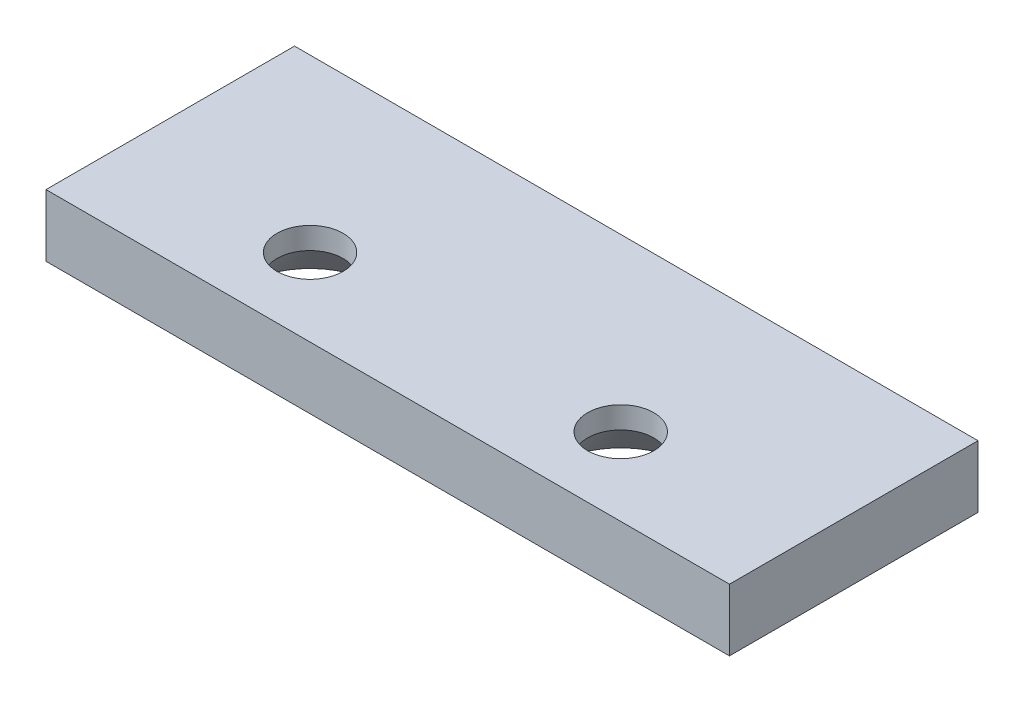
ISO-10303-21;
HEADER;
FILE_DESCRIPTION(('STEP AP214'),'2;1');
FILE_NAME('part.step','',(''),(''),'','','');
FILE_SCHEMA(('AUTOMOTIVE_DESIGN { 1 0 10303 214 1 1 1 1 }'));
ENDSEC;
DATA;
#1=APPLICATION_CONTEXT('core data for automotive mechanical design processes');
#2=APPLICATION_PROTOCOL_DEFINITION('international standard','automotive_design',2000,#1);
#3=PRODUCT_CONTEXT('',#1,'mechanical');
#4=PRODUCT('Part','Part','',(#3));
#5=PRODUCT_RELATED_PRODUCT_CATEGORY('part','',(#4));
#6=PRODUCT_DEFINITION_FORMATION('','',#4);
#7=PRODUCT_DEFINITION_CONTEXT('part definition',#1,'design');
#8=PRODUCT_DEFINITION('design','',#6,#7);
#9=PRODUCT_DEFINITION_SHAPE('','',#8);
#10=(LENGTH_UNIT() NAMED_UNIT(*) SI_UNIT(.MILLI.,.METRE.));
#11=(NAMED_UNIT(*) PLANE_ANGLE_UNIT() SI_UNIT($,.RADIAN.));
#12=(NAMED_UNIT(*) SI_UNIT($,.STERADIAN.) SOLID_ANGLE_UNIT());
#13=UNCERTAINTY_MEASURE_WITH_UNIT(LENGTH_MEASURE(1.E-05),#10,'distance_accuracy_value','');
#14=(GEOMETRIC_REPRESENTATION_CONTEXT(3) GLOBAL_UNCERTAINTY_ASSIGNED_CONTEXT((#13)) GLOBAL_UNIT_ASSIGNED_CONTEXT((#10,
#11,#12)) REPRESENTATION_CONTEXT('',''));
#15=CARTESIAN_POINT('',(0.,0.,0.));
#16=DIRECTION('',(0.,0.,1.));
#17=DIRECTION('',(1.,0.,0.));
#18=AXIS2_PLACEMENT_3D('',#15,#16,#17);
#19=CARTESIAN_POINT('',(-34.925,6.35,12.7));
#20=DIRECTION('',(1.,0.,0.));
#21=DIRECTION('',(0.,0.,-1.));
#22=AXIS2_PLACEMENT_3D('',#19,#20,#21);
#23=PLANE('',#22);
#24=DIRECTION('',(0.,0.,1.));
#25=VECTOR('',#24,1.);
#26=CARTESIAN_POINT('',(-34.925,0.,12.7));
#27=LINE('',#26,#25);
#28=CARTESIAN_POINT('',(-34.925,0.,-12.7));
#29=VERTEX_POINT('',#28);
#30=CARTESIAN_POINT('',(-34.925,0.,12.7));
#31=VERTEX_POINT('',#30);
#32=EDGE_CURVE('E100',#29,#31,#27,.T.);
#33=ORIENTED_EDGE('',*,*,#32,.T.);
#34=DIRECTION('',(0.,-1.,0.));
#35=VECTOR('',#34,1.);
#36=CARTESIAN_POINT('',(-34.925,6.35,12.7));
#37=LINE('',#36,#35);
#38=CARTESIAN_POINT('',(-34.925,6.35,12.7));
#39=VERTEX_POINT('',#38);
#40=EDGE_CURVE('E11',#39,#31,#37,.T.);
#41=ORIENTED_EDGE('',*,*,#40,.F.);
#42=DIRECTION('',(0.,0.,1.));
#43=VECTOR('',#42,1.);
#44=CARTESIAN_POINT('',(-34.925,6.35,12.7));
#45=LINE('',#44,#43);
#46=CARTESIAN_POINT('',(-34.925,6.35,-12.7));
#47=VERTEX_POINT('',#46);
#48=EDGE_CURVE('E87',#47,#39,#45,.T.);
#49=ORIENTED_EDGE('',*,*,#48,.F.);
#50=DIRECTION('',(0.,-1.,0.));
#51=VECTOR('',#50,1.);
#52=CARTESIAN_POINT('',(-34.925,6.35,-12.7));
#53=LINE('',#52,#51);
#54=EDGE_CURVE('E96',#47,#29,#53,.T.);
#55=ORIENTED_EDGE('',*,*,#54,.T.);
#56=EDGE_LOOP('',(#33,#41,#49,#55));
#57=FACE_BOUND('',#56,.T.);
#58=ADVANCED_FACE('F34',(#57),#23,.F.);
#59=CARTESIAN_POINT('',(34.925,6.35,12.7));
#60=DIRECTION('',(0.,0.,-1.));
#61=DIRECTION('',(-1.,0.,0.));
#62=AXIS2_PLACEMENT_3D('',#59,#60,#61);
#63=PLANE('',#62);
#64=DIRECTION('',(1.,0.,0.));
#65=VECTOR('',#64,1.);
#66=CARTESIAN_POINT('',(34.925,0.,12.7));
#67=LINE('',#66,#65);
#68=CARTESIAN_POINT('',(34.925,0.,12.7));
#69=VERTEX_POINT('',#68);
#70=EDGE_CURVE('E91',#31,#69,#67,.T.);
#71=ORIENTED_EDGE('',*,*,#70,.T.);
#72=DIRECTION('',(0.,-1.,0.));
#73=VECTOR('',#72,1.);
#74=CARTESIAN_POINT('',(34.925,6.35,12.7));
#75=LINE('',#74,#73);
#76=CARTESIAN_POINT('',(34.925,6.35,12.7));
#77=VERTEX_POINT('',#76);
#78=EDGE_CURVE('E43',#77,#69,#75,.T.);
#79=ORIENTED_EDGE('',*,*,#78,.F.);
#80=DIRECTION('',(1.,0.,0.));
#81=VECTOR('',#80,1.);
#82=CARTESIAN_POINT('',(34.925,6.35,12.7));
#83=LINE('',#82,#81);
#84=EDGE_CURVE('E82',#39,#77,#83,.T.);
#85=ORIENTED_EDGE('',*,*,#84,.F.);
#86=ORIENTED_EDGE('',*,*,#40,.T.);
#87=EDGE_LOOP('',(#71,#79,#85,#86));
#88=FACE_BOUND('',#87,.T.);
#89=ADVANCED_FACE('F90',(#88),#63,.F.);
#90=CARTESIAN_POINT('',(34.925,6.35,12.7));
#91=DIRECTION('',(-1.,0.,0.));
#92=DIRECTION('',(0.,0.,1.));
#93=AXIS2_PLACEMENT_3D('',#90,#91,#92);
#94=PLANE('',#93);
#95=DIRECTION('',(0.,0.,-1.));
#96=VECTOR('',#95,1.);
#97=CARTESIAN_POINT('',(34.925,0.,12.7));
#98=LINE('',#97,#96);
#99=CARTESIAN_POINT('',(34.925,0.,-12.7));
#100=VERTEX_POINT('',#99);
#101=EDGE_CURVE('E69',#69,#100,#98,.T.);
#102=ORIENTED_EDGE('',*,*,#101,.T.);
#103=DIRECTION('',(0.,-1.,0.));
#104=VECTOR('',#103,1.);
#105=CARTESIAN_POINT('',(34.925,6.35,-12.7));
#106=LINE('',#105,#104);
#107=CARTESIAN_POINT('',(34.925,6.35,-12.7));
#108=VERTEX_POINT('',#107);
#109=EDGE_CURVE('E92',#108,#100,#106,.T.);
#110=ORIENTED_EDGE('',*,*,#109,.F.);
#111=DIRECTION('',(0.,0.,-1.));
#112=VECTOR('',#111,1.);
#113=CARTESIAN_POINT('',(34.925,6.35,12.7));
#114=LINE('',#113,#112);
#115=EDGE_CURVE('E85',#77,#108,#114,.T.);
#116=ORIENTED_EDGE('',*,*,#115,.F.);
#117=ORIENTED_EDGE('',*,*,#78,.T.);
#118=EDGE_LOOP('',(#102,#110,#116,#117));
#119=FACE_BOUND('',#118,.T.);
#120=ADVANCED_FACE('F94',(#119),#94,.F.);
#121=CARTESIAN_POINT('',(34.925,6.35,-12.7));
#122=DIRECTION('',(0.,0.,1.));
#123=DIRECTION('',(1.,0.,0.));
#124=AXIS2_PLACEMENT_3D('',#121,#122,#123);
#125=PLANE('',#124);
#126=DIRECTION('',(-1.,0.,0.));
#127=VECTOR('',#126,1.);
#128=CARTESIAN_POINT('',(34.925,0.,-12.7));
#129=LINE('',#128,#127);
#130=EDGE_CURVE('E75',#100,#29,#129,.T.);
#131=ORIENTED_EDGE('',*,*,#130,.T.);
#132=ORIENTED_EDGE('',*,*,#54,.F.);
#133=DIRECTION('',(-1.,0.,0.));
#134=VECTOR('',#133,1.);
#135=CARTESIAN_POINT('',(34.925,6.35,-12.7));
#136=LINE('',#135,#134);
#137=EDGE_CURVE('E52',#108,#47,#136,.T.);
#138=ORIENTED_EDGE('',*,*,#137,.F.);
#139=ORIENTED_EDGE('',*,*,#109,.T.);
#140=EDGE_LOOP('',(#131,#132,#138,#139));
#141=FACE_BOUND('',#140,.T.);
#142=ADVANCED_FACE('F138',(#141),#125,.F.);
#143=CARTESIAN_POINT('',(0.,6.35,0.));
#144=DIRECTION('',(0.,1.,0.));
#145=DIRECTION('',(0.,0.,1.));
#146=AXIS2_PLACEMENT_3D('',#143,#144,#145);
#147=PLANE('',#146);
#148=CARTESIAN_POINT('',(-15.875,6.35,4.76250000000001));
#149=DIRECTION('',(0.,1.,0.));
#150=DIRECTION('',(0.,0.,1.));
#151=AXIS2_PLACEMENT_3D('',#148,#149,#150);
#152=CIRCLE('',#151,3.3782);
#153=CARTESIAN_POINT('',(-15.875,6.35,8.14070000000001));
#154=VERTEX_POINT('',#153);
#155=EDGE_CURVE('E37',#154,#154,#152,.T.);
#156=ORIENTED_EDGE('',*,*,#155,.F.);
#157=EDGE_LOOP('',(#156));
#158=FACE_BOUND('',#157,.T.);
#159=CARTESIAN_POINT('',(15.875,6.35,4.76250000000001));
#160=DIRECTION('',(0.,1.,0.));
#161=DIRECTION('',(0.,0.,1.));
#162=AXIS2_PLACEMENT_3D('',#159,#160,#161);
#163=CIRCLE('',#162,3.3782);
#164=CARTESIAN_POINT('',(15.875,6.35,8.14070000000001));
#165=VERTEX_POINT('',#164);
#166=EDGE_CURVE('E103',#165,#165,#163,.T.);
#167=ORIENTED_EDGE('',*,*,#166,.F.);
#168=EDGE_LOOP('',(#167));
#169=FACE_BOUND('',#168,.T.);
#170=ORIENTED_EDGE('',*,*,#48,.T.);
#171=ORIENTED_EDGE('',*,*,#84,.T.);
#172=ORIENTED_EDGE('',*,*,#115,.T.);
#173=ORIENTED_EDGE('',*,*,#137,.T.);
#174=EDGE_LOOP('',(#170,#171,#172,#173));
#175=FACE_BOUND('',#174,.T.);
#176=ADVANCED_FACE('F83',(#158,#169,#175),#147,.T.);
#177=CARTESIAN_POINT('',(0.,0.,0.));
#178=DIRECTION('',(0.,1.,0.));
#179=DIRECTION('',(0.,0.,1.));
#180=AXIS2_PLACEMENT_3D('',#177,#178,#179);
#181=PLANE('',#180);
#182=CARTESIAN_POINT('',(-15.875,0.,4.76250000000001));
#183=DIRECTION('',(0.,-1.,0.));
#184=DIRECTION('',(0.,0.,-1.));
#185=AXIS2_PLACEMENT_3D('',#182,#183,#184);
#186=CIRCLE('',#185,6.9596);
#187=CARTESIAN_POINT('',(-15.875,0.,-2.19709999999999));
#188=VERTEX_POINT('',#187);
#189=EDGE_CURVE('E123',#188,#188,#186,.T.);
#190=ORIENTED_EDGE('',*,*,#189,.F.);
#191=EDGE_LOOP('',(#190));
#192=FACE_BOUND('',#191,.T.);
#193=CARTESIAN_POINT('',(15.875,0.,4.76250000000001));
#194=DIRECTION('',(0.,-1.,0.));
#195=DIRECTION('',(0.,0.,-1.));
#196=AXIS2_PLACEMENT_3D('',#193,#194,#195);
#197=CIRCLE('',#196,6.9596);
#198=CARTESIAN_POINT('',(15.875,0.,-2.19709999999999));
#199=VERTEX_POINT('',#198);
#200=EDGE_CURVE('E113',#199,#199,#197,.T.);
#201=ORIENTED_EDGE('',*,*,#200,.F.);
#202=EDGE_LOOP('',(#201));
#203=FACE_BOUND('',#202,.T.);
#204=ORIENTED_EDGE('',*,*,#32,.F.);
#205=ORIENTED_EDGE('',*,*,#130,.F.);
#206=ORIENTED_EDGE('',*,*,#101,.F.);
#207=ORIENTED_EDGE('',*,*,#70,.F.);
#208=EDGE_LOOP('',(#204,#205,#206,#207));
#209=FACE_BOUND('',#208,.T.);
#210=ADVANCED_FACE('F129',(#192,#203,#209),#181,.F.);
#211=CARTESIAN_POINT('',(15.875,0.,4.76250000000001));
#212=DIRECTION('',(0.,-1.,0.));
#213=DIRECTION('',(0.,0.,-1.));
#214=AXIS2_PLACEMENT_3D('',#211,#212,#213);
#215=CYLINDRICAL_SURFACE('',#214,3.3782);
#216=ORIENTED_EDGE('',*,*,#166,.T.);
#217=EDGE_LOOP('',(#216));
#218=FACE_BOUND('',#217,.T.);
#219=CARTESIAN_POINT('',(15.875,4.11992941362132,4.76250000000001));
#220=DIRECTION('',(0.,-1.,0.));
#221=DIRECTION('',(0.,0.,-1.));
#222=AXIS2_PLACEMENT_3D('',#219,#220,#221);
#223=CIRCLE('',#222,3.3782);
#224=CARTESIAN_POINT('',(15.875,4.11992941362132,1.38430000000001));
#225=VERTEX_POINT('',#224);
#226=EDGE_CURVE('E109',#225,#225,#223,.T.);
#227=ORIENTED_EDGE('',*,*,#226,.T.);
#228=EDGE_LOOP('',(#227));
#229=FACE_BOUND('',#228,.T.);
#230=ADVANCED_FACE('F132',(#218,#229),#215,.F.);
#231=CARTESIAN_POINT('',(15.875,0.,4.76250000000001));
#232=DIRECTION('',(0.,-1.,0.));
#233=DIRECTION('',(0.,0.,-1.));
#234=AXIS2_PLACEMENT_3D('',#231,#232,#233);
#235=CONICAL_SURFACE('',#234,6.9596,0.715584993317676);
#236=ORIENTED_EDGE('',*,*,#226,.F.);
#237=EDGE_LOOP('',(#236));
#238=FACE_BOUND('',#237,.T.);
#239=ORIENTED_EDGE('',*,*,#200,.T.);
#240=EDGE_LOOP('',(#239));
#241=FACE_BOUND('',#240,.T.);
#242=ADVANCED_FACE('F183',(#238,#241),#235,.F.);
#243=CARTESIAN_POINT('',(-15.875,0.,4.76250000000001));
#244=DIRECTION('',(0.,-1.,0.));
#245=DIRECTION('',(0.,0.,-1.));
#246=AXIS2_PLACEMENT_3D('',#243,#244,#245);
#247=CYLINDRICAL_SURFACE('',#246,3.3782);
#248=ORIENTED_EDGE('',*,*,#155,.T.);
#249=EDGE_LOOP('',(#248));
#250=FACE_BOUND('',#249,.T.);
#251=CARTESIAN_POINT('',(-15.875,4.11992941362132,4.76250000000001));
#252=DIRECTION('',(0.,-1.,0.));
#253=DIRECTION('',(0.,0.,-1.));
#254=AXIS2_PLACEMENT_3D('',#251,#252,#253);
#255=CIRCLE('',#254,3.3782);
#256=CARTESIAN_POINT('',(-15.875,4.11992941362132,1.38430000000001));
#257=VERTEX_POINT('',#256);
#258=EDGE_CURVE('E120',#257,#257,#255,.T.);
#259=ORIENTED_EDGE('',*,*,#258,.T.);
#260=EDGE_LOOP('',(#259));
#261=FACE_BOUND('',#260,.T.);
#262=ADVANCED_FACE('F193',(#250,#261),#247,.F.);
#263=CARTESIAN_POINT('',(-15.875,0.,4.76250000000001));
#264=DIRECTION('',(0.,-1.,0.));
#265=DIRECTION('',(0.,0.,-1.));
#266=AXIS2_PLACEMENT_3D('',#263,#264,#265);
#267=CONICAL_SURFACE('',#266,6.9596,0.715584993317676);
#268=ORIENTED_EDGE('',*,*,#258,.F.);
#269=EDGE_LOOP('',(#268));
#270=FACE_BOUND('',#269,.T.);
#271=ORIENTED_EDGE('',*,*,#189,.T.);
#272=EDGE_LOOP('',(#271));
#273=FACE_BOUND('',#272,.T.);
#274=ADVANCED_FACE('F127',(#270,#273),#267,.F.);
#275=CLOSED_SHELL('',(#58,#89,#120,#142,#176,#210,#230,#242,#262,#274));
#276=MANIFOLD_SOLID_BREP('B2',#275);
#277=ADVANCED_BREP_SHAPE_REPRESENTATION('',(#18,#276),#14);
#278=SHAPE_DEFINITION_REPRESENTATION(#9,#277);
ENDSEC;
END-ISO-10303-21;
